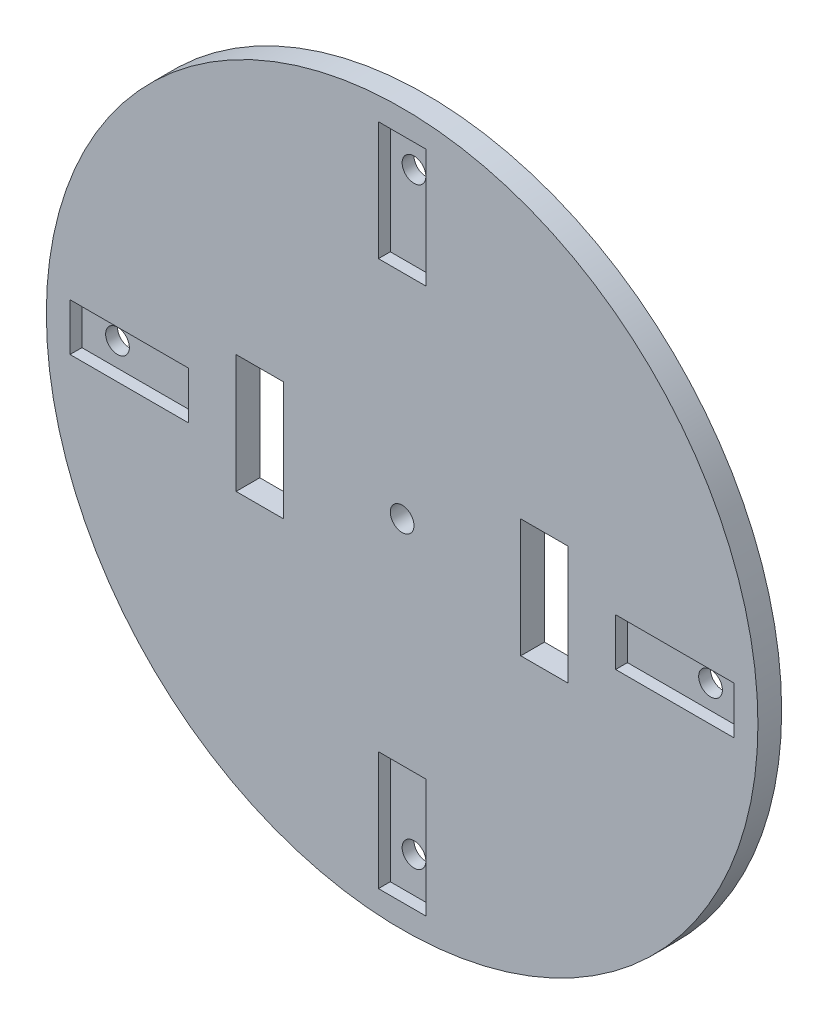
ISO-10303-21;
HEADER;
FILE_DESCRIPTION(('STEP AP214'),'2;1');
FILE_NAME('part.step','',(''),(''),'','','');
FILE_SCHEMA(('AUTOMOTIVE_DESIGN { 1 0 10303 214 1 1 1 1 }'));
ENDSEC;
DATA;
#1=APPLICATION_CONTEXT('core data for automotive mechanical design processes');
#2=APPLICATION_PROTOCOL_DEFINITION('international standard','automotive_design',2000,#1);
#3=PRODUCT_CONTEXT('',#1,'mechanical');
#4=PRODUCT('Part','Part','',(#3));
#5=PRODUCT_RELATED_PRODUCT_CATEGORY('part','',(#4));
#6=PRODUCT_DEFINITION_FORMATION('','',#4);
#7=PRODUCT_DEFINITION_CONTEXT('part definition',#1,'design');
#8=PRODUCT_DEFINITION('design','',#6,#7);
#9=PRODUCT_DEFINITION_SHAPE('','',#8);
#10=(LENGTH_UNIT() NAMED_UNIT(*) SI_UNIT(.MILLI.,.METRE.));
#11=(NAMED_UNIT(*) PLANE_ANGLE_UNIT() SI_UNIT($,.RADIAN.));
#12=(NAMED_UNIT(*) SI_UNIT($,.STERADIAN.) SOLID_ANGLE_UNIT());
#13=UNCERTAINTY_MEASURE_WITH_UNIT(LENGTH_MEASURE(1.E-05),#10,'distance_accuracy_value','');
#14=(GEOMETRIC_REPRESENTATION_CONTEXT(3) GLOBAL_UNCERTAINTY_ASSIGNED_CONTEXT((#13)) GLOBAL_UNIT_ASSIGNED_CONTEXT((#10,
#11,#12)) REPRESENTATION_CONTEXT('',''));
#15=CARTESIAN_POINT('',(0.,0.,0.));
#16=DIRECTION('',(0.,0.,1.));
#17=DIRECTION('',(1.,0.,0.));
#18=AXIS2_PLACEMENT_3D('',#15,#16,#17);
#19=CARTESIAN_POINT('',(-15.3907634201222,6.93034376227723,10.));
#20=DIRECTION('',(0.,0.,1.));
#21=DIRECTION('',(1.,0.,0.));
#22=AXIS2_PLACEMENT_3D('',#19,#20,#21);
#23=PLANE('',#22);
#24=DIRECTION('',(-1.,0.,0.));
#25=VECTOR('',#24,1.);
#26=CARTESIAN_POINT('',(-15.3907634201222,31.9303437622817,10.));
#27=LINE('',#26,#25);
#28=CARTESIAN_POINT('',(54.6092365798777,31.9303437622817,10.));
#29=VERTEX_POINT('',#28);
#30=CARTESIAN_POINT('',(34.6092365798778,31.9303437622817,10.));
#31=VERTEX_POINT('',#30);
#32=EDGE_CURVE('E202',#29,#31,#27,.T.);
#33=ORIENTED_EDGE('',*,*,#32,.F.);
#34=DIRECTION('',(0.,1.,0.));
#35=VECTOR('',#34,1.);
#36=CARTESIAN_POINT('',(54.6092365798778,6.93034376227724,10.));
#37=LINE('',#36,#35);
#38=CARTESIAN_POINT('',(54.6092365798778,-18.0696562377183,10.));
#39=VERTEX_POINT('',#38);
#40=EDGE_CURVE('E263',#39,#29,#37,.T.);
#41=ORIENTED_EDGE('',*,*,#40,.F.);
#42=DIRECTION('',(1.,0.,0.));
#43=VECTOR('',#42,1.);
#44=CARTESIAN_POINT('',(-15.3907634201222,-18.0696562377183,10.));
#45=LINE('',#44,#43);
#46=CARTESIAN_POINT('',(34.6092365798777,-18.0696562377183,10.));
#47=VERTEX_POINT('',#46);
#48=EDGE_CURVE('E261',#47,#39,#45,.T.);
#49=ORIENTED_EDGE('',*,*,#48,.F.);
#50=DIRECTION('',(0.,-1.,0.));
#51=VECTOR('',#50,1.);
#52=CARTESIAN_POINT('',(34.6092365798777,6.93034376227723,10.));
#53=LINE('',#52,#51);
#54=EDGE_CURVE('E259',#31,#47,#53,.T.);
#55=ORIENTED_EDGE('',*,*,#54,.F.);
#56=EDGE_LOOP('',(#33,#41,#49,#55));
#57=FACE_BOUND('',#56,.T.);
#58=DIRECTION('',(0.,1.,0.));
#59=VECTOR('',#58,1.);
#60=CARTESIAN_POINT('',(-65.3907634201223,6.93034376227723,10.));
#61=LINE('',#60,#59);
#62=CARTESIAN_POINT('',(-65.3907634201223,-18.0696562377228,10.));
#63=VERTEX_POINT('',#62);
#64=CARTESIAN_POINT('',(-65.3907634201223,31.9303437622772,10.));
#65=VERTEX_POINT('',#64);
#66=EDGE_CURVE('E257',#63,#65,#61,.T.);
#67=ORIENTED_EDGE('',*,*,#66,.F.);
#68=DIRECTION('',(1.,0.,0.));
#69=VECTOR('',#68,1.);
#70=CARTESIAN_POINT('',(-15.3907634201222,-18.0696562377228,10.));
#71=LINE('',#70,#69);
#72=CARTESIAN_POINT('',(-85.3907634201223,-18.0696562377228,10.));
#73=VERTEX_POINT('',#72);
#74=EDGE_CURVE('E255',#73,#63,#71,.T.);
#75=ORIENTED_EDGE('',*,*,#74,.F.);
#76=DIRECTION('',(0.,-1.,0.));
#77=VECTOR('',#76,1.);
#78=CARTESIAN_POINT('',(-85.3907634201223,6.93034376227723,10.));
#79=LINE('',#78,#77);
#80=CARTESIAN_POINT('',(-85.3907634201223,31.9303437622772,10.));
#81=VERTEX_POINT('',#80);
#82=EDGE_CURVE('E253',#81,#73,#79,.T.);
#83=ORIENTED_EDGE('',*,*,#82,.F.);
#84=DIRECTION('',(-1.,0.,0.));
#85=VECTOR('',#84,1.);
#86=CARTESIAN_POINT('',(-15.3907634201222,31.9303437622772,10.));
#87=LINE('',#86,#85);
#88=EDGE_CURVE('E229',#65,#81,#87,.T.);
#89=ORIENTED_EDGE('',*,*,#88,.F.);
#90=EDGE_LOOP('',(#67,#75,#83,#89));
#91=FACE_BOUND('',#90,.T.);
#92=DIRECTION('',(0.,1.,0.));
#93=VECTOR('',#92,1.);
#94=CARTESIAN_POINT('',(-5.39076342012216,146.930343762277,10.));
#95=LINE('',#94,#93);
#96=CARTESIAN_POINT('',(-5.39076342012216,96.9303437622773,10.));
#97=VERTEX_POINT('',#96);
#98=CARTESIAN_POINT('',(-5.39076342012216,146.930343762277,10.));
#99=VERTEX_POINT('',#98);
#100=EDGE_CURVE('E305',#97,#99,#95,.T.);
#101=ORIENTED_EDGE('',*,*,#100,.F.);
#102=DIRECTION('',(1.,0.,0.));
#103=VECTOR('',#102,1.);
#104=CARTESIAN_POINT('',(-25.3907634201222,96.9303437622773,10.));
#105=LINE('',#104,#103);
#106=CARTESIAN_POINT('',(-25.3907634201222,96.9303437622773,10.));
#107=VERTEX_POINT('',#106);
#108=EDGE_CURVE('E295',#107,#97,#105,.T.);
#109=ORIENTED_EDGE('',*,*,#108,.F.);
#110=DIRECTION('',(0.,-1.,0.));
#111=VECTOR('',#110,1.);
#112=CARTESIAN_POINT('',(-25.3907634201222,146.930343762277,10.));
#113=LINE('',#112,#111);
#114=CARTESIAN_POINT('',(-25.3907634201222,146.930343762277,10.));
#115=VERTEX_POINT('',#114);
#116=EDGE_CURVE('E311',#115,#107,#113,.T.);
#117=ORIENTED_EDGE('',*,*,#116,.F.);
#118=DIRECTION('',(-1.,0.,0.));
#119=VECTOR('',#118,1.);
#120=CARTESIAN_POINT('',(-25.3907634201222,146.930343762277,10.));
#121=LINE('',#120,#119);
#122=EDGE_CURVE('E307',#99,#115,#121,.T.);
#123=ORIENTED_EDGE('',*,*,#122,.F.);
#124=EDGE_LOOP('',(#101,#109,#117,#123));
#125=FACE_BOUND('',#124,.T.);
#126=DIRECTION('',(0.,-1.,0.));
#127=VECTOR('',#126,1.);
#128=CARTESIAN_POINT('',(74.6092365798779,16.9303437622769,10.));
#129=LINE('',#128,#127);
#130=CARTESIAN_POINT('',(74.6092365798779,16.9303437622769,10.));
#131=VERTEX_POINT('',#130);
#132=CARTESIAN_POINT('',(74.6092365798778,-3.06965623772309,10.));
#133=VERTEX_POINT('',#132);
#134=EDGE_CURVE('E308',#131,#133,#129,.T.);
#135=ORIENTED_EDGE('',*,*,#134,.F.);
#136=DIRECTION('',(-1.,0.,0.));
#137=VECTOR('',#136,1.);
#138=CARTESIAN_POINT('',(124.609236579878,16.9303437622767,10.));
#139=LINE('',#138,#137);
#140=CARTESIAN_POINT('',(124.609236579878,16.9303437622767,10.));
#141=VERTEX_POINT('',#140);
#142=EDGE_CURVE('E336',#141,#131,#139,.T.);
#143=ORIENTED_EDGE('',*,*,#142,.F.);
#144=DIRECTION('',(0.,1.,0.));
#145=VECTOR('',#144,1.);
#146=CARTESIAN_POINT('',(124.609236579878,16.9303437622767,10.));
#147=LINE('',#146,#145);
#148=CARTESIAN_POINT('',(124.609236579878,-3.06965623772327,10.));
#149=VERTEX_POINT('',#148);
#150=EDGE_CURVE('E339',#149,#141,#147,.T.);
#151=ORIENTED_EDGE('',*,*,#150,.F.);
#152=DIRECTION('',(1.,0.,0.));
#153=VECTOR('',#152,1.);
#154=CARTESIAN_POINT('',(124.609236579878,-3.06965623772327,10.));
#155=LINE('',#154,#153);
#156=EDGE_CURVE('E343',#133,#149,#155,.T.);
#157=ORIENTED_EDGE('',*,*,#156,.F.);
#158=EDGE_LOOP('',(#135,#143,#151,#157));
#159=FACE_BOUND('',#158,.T.);
#160=DIRECTION('',(-1.,0.,0.));
#161=VECTOR('',#160,1.);
#162=CARTESIAN_POINT('',(-5.39076342012279,-83.0696562377229,10.));
#163=LINE('',#162,#161);
#164=CARTESIAN_POINT('',(-5.39076342012279,-83.0696562377229,10.));
#165=VERTEX_POINT('',#164);
#166=CARTESIAN_POINT('',(-25.3907634201228,-83.0696562377227,10.));
#167=VERTEX_POINT('',#166);
#168=EDGE_CURVE('E335',#165,#167,#163,.T.);
#169=ORIENTED_EDGE('',*,*,#168,.F.);
#170=DIRECTION('',(0.,1.,0.));
#171=VECTOR('',#170,1.);
#172=CARTESIAN_POINT('',(-5.39076342012314,-133.069656237723,10.));
#173=LINE('',#172,#171);
#174=CARTESIAN_POINT('',(-5.39076342012314,-133.069656237723,10.));
#175=VERTEX_POINT('',#174);
#176=EDGE_CURVE('E368',#175,#165,#173,.T.);
#177=ORIENTED_EDGE('',*,*,#176,.F.);
#178=DIRECTION('',(1.,0.,0.));
#179=VECTOR('',#178,1.);
#180=CARTESIAN_POINT('',(-5.39076342012314,-133.069656237723,10.));
#181=LINE('',#180,#179);
#182=CARTESIAN_POINT('',(-25.3907634201231,-133.069656237723,10.));
#183=VERTEX_POINT('',#182);
#184=EDGE_CURVE('E371',#183,#175,#181,.T.);
#185=ORIENTED_EDGE('',*,*,#184,.F.);
#186=DIRECTION('',(0.,-1.,0.));
#187=VECTOR('',#186,1.);
#188=CARTESIAN_POINT('',(-25.3907634201231,-133.069656237723,10.));
#189=LINE('',#188,#187);
#190=EDGE_CURVE('E375',#167,#183,#189,.T.);
#191=ORIENTED_EDGE('',*,*,#190,.F.);
#192=EDGE_LOOP('',(#169,#177,#185,#191));
#193=FACE_BOUND('',#192,.T.);
#194=DIRECTION('',(0.,1.,0.));
#195=VECTOR('',#194,1.);
#196=CARTESIAN_POINT('',(-105.390763420122,-3.06965623772184,10.));
#197=LINE('',#196,#195);
#198=CARTESIAN_POINT('',(-105.390763420122,-3.06965623772184,10.));
#199=VERTEX_POINT('',#198);
#200=CARTESIAN_POINT('',(-105.390763420122,16.9303437622782,10.));
#201=VERTEX_POINT('',#200);
#202=EDGE_CURVE('E367',#199,#201,#197,.T.);
#203=ORIENTED_EDGE('',*,*,#202,.F.);
#204=DIRECTION('',(1.,0.,0.));
#205=VECTOR('',#204,1.);
#206=CARTESIAN_POINT('',(-155.390763420122,-3.06965623772131,10.));
#207=LINE('',#206,#205);
#208=CARTESIAN_POINT('',(-155.390763420122,-3.06965623772131,10.));
#209=VERTEX_POINT('',#208);
#210=EDGE_CURVE('E398',#209,#199,#207,.T.);
#211=ORIENTED_EDGE('',*,*,#210,.F.);
#212=DIRECTION('',(0.,-1.,0.));
#213=VECTOR('',#212,1.);
#214=CARTESIAN_POINT('',(-155.390763420122,-3.06965623772131,10.));
#215=LINE('',#214,#213);
#216=CARTESIAN_POINT('',(-155.390763420122,16.9303437622787,10.));
#217=VERTEX_POINT('',#216);
#218=EDGE_CURVE('E401',#217,#209,#215,.T.);
#219=ORIENTED_EDGE('',*,*,#218,.F.);
#220=DIRECTION('',(-1.,0.,0.));
#221=VECTOR('',#220,1.);
#222=CARTESIAN_POINT('',(-155.390763420122,16.9303437622787,10.));
#223=LINE('',#222,#221);
#224=EDGE_CURVE('E405',#201,#217,#223,.T.);
#225=ORIENTED_EDGE('',*,*,#224,.F.);
#226=EDGE_LOOP('',(#203,#211,#219,#225));
#227=FACE_BOUND('',#226,.T.);
#228=CARTESIAN_POINT('',(-15.3907634201222,6.93034376227723,10.));
#229=DIRECTION('',(0.,0.,1.));
#230=DIRECTION('',(1.,0.,0.));
#231=AXIS2_PLACEMENT_3D('',#228,#229,#230);
#232=CIRCLE('',#231,150.);
#233=CARTESIAN_POINT('',(134.609236579878,6.93034376227723,10.));
#234=VERTEX_POINT('',#233);
#235=EDGE_CURVE('E11',#234,#234,#232,.T.);
#236=ORIENTED_EDGE('',*,*,#235,.T.);
#237=EDGE_LOOP('',(#236));
#238=FACE_BOUND('',#237,.T.);
#239=CARTESIAN_POINT('',(-15.3907634201222,6.93034376227723,10.));
#240=DIRECTION('',(0.,0.,1.));
#241=DIRECTION('',(1.,0.,0.));
#242=AXIS2_PLACEMENT_3D('',#239,#240,#241);
#243=CIRCLE('',#242,5.);
#244=CARTESIAN_POINT('',(-10.3907634201222,6.93034376227723,10.));
#245=VERTEX_POINT('',#244);
#246=EDGE_CURVE('E419',#245,#245,#243,.T.);
#247=ORIENTED_EDGE('',*,*,#246,.F.);
#248=EDGE_LOOP('',(#247));
#249=FACE_BOUND('',#248,.T.);
#250=ADVANCED_FACE('F36',(#57,#91,#125,#159,#193,#227,#238,#249),#23,.T.);
#251=CARTESIAN_POINT('',(-15.3907634201222,6.93034376227723,0.));
#252=DIRECTION('',(0.,0.,1.));
#253=DIRECTION('',(1.,0.,0.));
#254=AXIS2_PLACEMENT_3D('',#251,#252,#253);
#255=PLANE('',#254);
#256=DIRECTION('',(0.,1.,0.));
#257=VECTOR('',#256,1.);
#258=CARTESIAN_POINT('',(54.6092365798778,-18.0696562377183,0.));
#259=LINE('',#258,#257);
#260=CARTESIAN_POINT('',(54.6092365798778,-18.0696562377183,0.));
#261=VERTEX_POINT('',#260);
#262=CARTESIAN_POINT('',(54.6092365798777,31.9303437622817,0.));
#263=VERTEX_POINT('',#262);
#264=EDGE_CURVE('E205',#261,#263,#259,.T.);
#265=ORIENTED_EDGE('',*,*,#264,.T.);
#266=DIRECTION('',(-1.,0.,0.));
#267=VECTOR('',#266,1.);
#268=CARTESIAN_POINT('',(54.6092365798777,31.9303437622817,0.));
#269=LINE('',#268,#267);
#270=CARTESIAN_POINT('',(34.6092365798778,31.9303437622817,0.));
#271=VERTEX_POINT('',#270);
#272=EDGE_CURVE('E199',#263,#271,#269,.T.);
#273=ORIENTED_EDGE('',*,*,#272,.T.);
#274=DIRECTION('',(0.,-1.,0.));
#275=VECTOR('',#274,1.);
#276=CARTESIAN_POINT('',(34.6092365798777,-18.0696562377183,0.));
#277=LINE('',#276,#275);
#278=CARTESIAN_POINT('',(34.6092365798777,-18.0696562377183,0.));
#279=VERTEX_POINT('',#278);
#280=EDGE_CURVE('E209',#271,#279,#277,.T.);
#281=ORIENTED_EDGE('',*,*,#280,.T.);
#282=DIRECTION('',(1.,0.,0.));
#283=VECTOR('',#282,1.);
#284=CARTESIAN_POINT('',(54.6092365798778,-18.0696562377183,0.));
#285=LINE('',#284,#283);
#286=EDGE_CURVE('E214',#279,#261,#285,.T.);
#287=ORIENTED_EDGE('',*,*,#286,.T.);
#288=EDGE_LOOP('',(#265,#273,#281,#287));
#289=FACE_BOUND('',#288,.T.);
#290=DIRECTION('',(1.,0.,0.));
#291=VECTOR('',#290,1.);
#292=CARTESIAN_POINT('',(-85.3907634201223,-18.0696562377228,0.));
#293=LINE('',#292,#291);
#294=CARTESIAN_POINT('',(-85.3907634201223,-18.0696562377228,0.));
#295=VERTEX_POINT('',#294);
#296=CARTESIAN_POINT('',(-65.3907634201223,-18.0696562377228,0.));
#297=VERTEX_POINT('',#296);
#298=EDGE_CURVE('E235',#295,#297,#293,.T.);
#299=ORIENTED_EDGE('',*,*,#298,.T.);
#300=DIRECTION('',(0.,1.,0.));
#301=VECTOR('',#300,1.);
#302=CARTESIAN_POINT('',(-65.3907634201223,31.9303437622772,0.));
#303=LINE('',#302,#301);
#304=CARTESIAN_POINT('',(-65.3907634201223,31.9303437622772,0.));
#305=VERTEX_POINT('',#304);
#306=EDGE_CURVE('E219',#297,#305,#303,.T.);
#307=ORIENTED_EDGE('',*,*,#306,.T.);
#308=DIRECTION('',(-1.,0.,0.));
#309=VECTOR('',#308,1.);
#310=CARTESIAN_POINT('',(-85.3907634201223,31.9303437622772,0.));
#311=LINE('',#310,#309);
#312=CARTESIAN_POINT('',(-85.3907634201223,31.9303437622772,0.));
#313=VERTEX_POINT('',#312);
#314=EDGE_CURVE('E222',#305,#313,#311,.T.);
#315=ORIENTED_EDGE('',*,*,#314,.T.);
#316=DIRECTION('',(0.,-1.,0.));
#317=VECTOR('',#316,1.);
#318=CARTESIAN_POINT('',(-85.3907634201223,31.9303437622772,0.));
#319=LINE('',#318,#317);
#320=EDGE_CURVE('E247',#313,#295,#319,.T.);
#321=ORIENTED_EDGE('',*,*,#320,.T.);
#322=EDGE_LOOP('',(#299,#307,#315,#321));
#323=FACE_BOUND('',#322,.T.);
#324=CARTESIAN_POINT('',(109.609236579878,6.93034376227691,0.));
#325=DIRECTION('',(0.,0.,1.));
#326=DIRECTION('',(1.,0.,0.));
#327=AXIS2_PLACEMENT_3D('',#324,#325,#326);
#328=CIRCLE('',#327,5.);
#329=CARTESIAN_POINT('',(114.609236579878,6.93034376227691,0.));
#330=VERTEX_POINT('',#329);
#331=EDGE_CURVE('E267',#330,#330,#328,.T.);
#332=ORIENTED_EDGE('',*,*,#331,.T.);
#333=EDGE_LOOP('',(#332));
#334=FACE_BOUND('',#333,.T.);
#335=CARTESIAN_POINT('',(-15.3907634201229,-118.069656237723,0.));
#336=DIRECTION('',(0.,0.,1.));
#337=DIRECTION('',(1.,0.,0.));
#338=AXIS2_PLACEMENT_3D('',#335,#336,#337);
#339=CIRCLE('',#338,5.);
#340=CARTESIAN_POINT('',(-10.3907634201229,-118.069656237723,0.));
#341=VERTEX_POINT('',#340);
#342=EDGE_CURVE('E277',#341,#341,#339,.T.);
#343=ORIENTED_EDGE('',*,*,#342,.T.);
#344=EDGE_LOOP('',(#343));
#345=FACE_BOUND('',#344,.T.);
#346=CARTESIAN_POINT('',(-140.390763420122,6.93034376227837,0.));
#347=DIRECTION('',(0.,0.,1.));
#348=DIRECTION('',(1.,0.,0.));
#349=AXIS2_PLACEMENT_3D('',#346,#347,#348);
#350=CIRCLE('',#349,5.00000000000003);
#351=CARTESIAN_POINT('',(-135.390763420122,6.93034376227837,0.));
#352=VERTEX_POINT('',#351);
#353=EDGE_CURVE('E283',#352,#352,#350,.T.);
#354=ORIENTED_EDGE('',*,*,#353,.T.);
#355=EDGE_LOOP('',(#354));
#356=FACE_BOUND('',#355,.T.);
#357=CARTESIAN_POINT('',(-15.3907634201205,131.930343762277,0.));
#358=DIRECTION('',(0.,0.,1.));
#359=DIRECTION('',(1.,0.,0.));
#360=AXIS2_PLACEMENT_3D('',#357,#358,#359);
#361=CIRCLE('',#360,4.99999999999998);
#362=CARTESIAN_POINT('',(-10.3907634201206,131.930343762277,0.));
#363=VERTEX_POINT('',#362);
#364=EDGE_CURVE('E266',#363,#363,#361,.T.);
#365=ORIENTED_EDGE('',*,*,#364,.T.);
#366=EDGE_LOOP('',(#365));
#367=FACE_BOUND('',#366,.T.);
#368=CARTESIAN_POINT('',(-15.3907634201222,6.93034376227723,0.));
#369=DIRECTION('',(0.,0.,1.));
#370=DIRECTION('',(1.,0.,0.));
#371=AXIS2_PLACEMENT_3D('',#368,#369,#370);
#372=CIRCLE('',#371,150.);
#373=CARTESIAN_POINT('',(134.609236579878,6.93034376227723,0.));
#374=VERTEX_POINT('',#373);
#375=EDGE_CURVE('E40',#374,#374,#372,.T.);
#376=ORIENTED_EDGE('',*,*,#375,.F.);
#377=EDGE_LOOP('',(#376));
#378=FACE_BOUND('',#377,.T.);
#379=CARTESIAN_POINT('',(-15.3907634201222,6.93034376227723,0.));
#380=DIRECTION('',(0.,0.,1.));
#381=DIRECTION('',(1.,0.,0.));
#382=AXIS2_PLACEMENT_3D('',#379,#380,#381);
#383=CIRCLE('',#382,5.);
#384=CARTESIAN_POINT('',(-10.3907634201222,6.93034376227723,0.));
#385=VERTEX_POINT('',#384);
#386=EDGE_CURVE('E318',#385,#385,#383,.T.);
#387=ORIENTED_EDGE('',*,*,#386,.T.);
#388=EDGE_LOOP('',(#387));
#389=FACE_BOUND('',#388,.T.);
#390=ADVANCED_FACE('F216',(#289,#323,#334,#345,#356,#367,#378,#389),#255,.F.);
#391=CARTESIAN_POINT('',(-15.3907634201222,6.93034376227723,10.));
#392=DIRECTION('',(0.,0.,-1.));
#393=DIRECTION('',(-1.,0.,0.));
#394=AXIS2_PLACEMENT_3D('',#391,#392,#393);
#395=CYLINDRICAL_SURFACE('',#394,150.);
#396=ORIENTED_EDGE('',*,*,#235,.F.);
#397=EDGE_LOOP('',(#396));
#398=FACE_BOUND('',#397,.T.);
#399=ORIENTED_EDGE('',*,*,#375,.T.);
#400=EDGE_LOOP('',(#399));
#401=FACE_BOUND('',#400,.T.);
#402=ADVANCED_FACE('F38',(#398,#401),#395,.T.);
#403=CARTESIAN_POINT('',(-15.3907634201222,6.93034376227723,10.));
#404=DIRECTION('',(0.,0.,-1.));
#405=DIRECTION('',(-1.,0.,0.));
#406=AXIS2_PLACEMENT_3D('',#403,#404,#405);
#407=CYLINDRICAL_SURFACE('',#406,5.);
#408=ORIENTED_EDGE('',*,*,#246,.T.);
#409=EDGE_LOOP('',(#408));
#410=FACE_BOUND('',#409,.T.);
#411=ORIENTED_EDGE('',*,*,#386,.F.);
#412=EDGE_LOOP('',(#411));
#413=FACE_BOUND('',#412,.T.);
#414=ADVANCED_FACE('F426',(#410,#413),#407,.F.);
#415=CARTESIAN_POINT('',(-105.390763420122,-3.06965623772184,5.));
#416=DIRECTION('',(1.,0.,0.));
#417=DIRECTION('',(0.,1.,0.));
#418=AXIS2_PLACEMENT_3D('',#415,#416,#417);
#419=PLANE('',#418);
#420=ORIENTED_EDGE('',*,*,#202,.T.);
#421=DIRECTION('',(0.,0.,1.));
#422=VECTOR('',#421,1.);
#423=CARTESIAN_POINT('',(-105.390763420122,16.9303437622782,5.));
#424=LINE('',#423,#422);
#425=CARTESIAN_POINT('',(-105.390763420122,16.9303437622782,5.));
#426=VERTEX_POINT('',#425);
#427=EDGE_CURVE('E389',#426,#201,#424,.T.);
#428=ORIENTED_EDGE('',*,*,#427,.F.);
#429=DIRECTION('',(0.,1.,0.));
#430=VECTOR('',#429,1.);
#431=CARTESIAN_POINT('',(-105.390763420122,-3.06965623772184,5.));
#432=LINE('',#431,#430);
#433=CARTESIAN_POINT('',(-105.390763420122,-3.06965623772184,5.));
#434=VERTEX_POINT('',#433);
#435=EDGE_CURVE('E402',#434,#426,#432,.T.);
#436=ORIENTED_EDGE('',*,*,#435,.F.);
#437=DIRECTION('',(0.,0.,1.));
#438=VECTOR('',#437,1.);
#439=CARTESIAN_POINT('',(-105.390763420122,-3.06965623772184,5.));
#440=LINE('',#439,#438);
#441=EDGE_CURVE('E270',#434,#199,#440,.T.);
#442=ORIENTED_EDGE('',*,*,#441,.T.);
#443=EDGE_LOOP('',(#420,#428,#436,#442));
#444=FACE_BOUND('',#443,.T.);
#445=ADVANCED_FACE('F428',(#444),#419,.F.);
#446=CARTESIAN_POINT('',(-155.390763420122,-3.06965623772131,5.));
#447=DIRECTION('',(0.,-1.,0.));
#448=DIRECTION('',(1.,0.,0.));
#449=AXIS2_PLACEMENT_3D('',#446,#447,#448);
#450=PLANE('',#449);
#451=ORIENTED_EDGE('',*,*,#210,.T.);
#452=ORIENTED_EDGE('',*,*,#441,.F.);
#453=DIRECTION('',(1.,0.,0.));
#454=VECTOR('',#453,1.);
#455=CARTESIAN_POINT('',(-155.390763420122,-3.06965623772131,5.));
#456=LINE('',#455,#454);
#457=CARTESIAN_POINT('',(-155.390763420122,-3.06965623772131,5.));
#458=VERTEX_POINT('',#457);
#459=EDGE_CURVE('E392',#458,#434,#456,.T.);
#460=ORIENTED_EDGE('',*,*,#459,.F.);
#461=DIRECTION('',(0.,0.,1.));
#462=VECTOR('',#461,1.);
#463=CARTESIAN_POINT('',(-155.390763420122,-3.06965623772131,5.));
#464=LINE('',#463,#462);
#465=EDGE_CURVE('E395',#458,#209,#464,.T.);
#466=ORIENTED_EDGE('',*,*,#465,.T.);
#467=EDGE_LOOP('',(#451,#452,#460,#466));
#468=FACE_BOUND('',#467,.T.);
#469=ADVANCED_FACE('F435',(#468),#450,.F.);
#470=CARTESIAN_POINT('',(-155.390763420122,-3.06965623772131,5.));
#471=DIRECTION('',(-1.,0.,0.));
#472=DIRECTION('',(0.,-1.,0.));
#473=AXIS2_PLACEMENT_3D('',#470,#471,#472);
#474=PLANE('',#473);
#475=ORIENTED_EDGE('',*,*,#218,.T.);
#476=ORIENTED_EDGE('',*,*,#465,.F.);
#477=DIRECTION('',(0.,-1.,0.));
#478=VECTOR('',#477,1.);
#479=CARTESIAN_POINT('',(-155.390763420122,-3.06965623772131,5.));
#480=LINE('',#479,#478);
#481=CARTESIAN_POINT('',(-155.390763420122,16.9303437622787,5.));
#482=VERTEX_POINT('',#481);
#483=EDGE_CURVE('E411',#482,#458,#480,.T.);
#484=ORIENTED_EDGE('',*,*,#483,.F.);
#485=DIRECTION('',(0.,0.,1.));
#486=VECTOR('',#485,1.);
#487=CARTESIAN_POINT('',(-155.390763420122,16.9303437622787,5.));
#488=LINE('',#487,#486);
#489=EDGE_CURVE('E393',#482,#217,#488,.T.);
#490=ORIENTED_EDGE('',*,*,#489,.T.);
#491=EDGE_LOOP('',(#475,#476,#484,#490));
#492=FACE_BOUND('',#491,.T.);
#493=ADVANCED_FACE('F486',(#492),#474,.F.);
#494=CARTESIAN_POINT('',(-155.390763420122,16.9303437622787,5.));
#495=DIRECTION('',(0.,1.,0.));
#496=DIRECTION('',(-1.,0.,0.));
#497=AXIS2_PLACEMENT_3D('',#494,#495,#496);
#498=PLANE('',#497);
#499=ORIENTED_EDGE('',*,*,#224,.T.);
#500=ORIENTED_EDGE('',*,*,#489,.F.);
#501=DIRECTION('',(-1.,0.,0.));
#502=VECTOR('',#501,1.);
#503=CARTESIAN_POINT('',(-155.390763420122,16.9303437622787,5.));
#504=LINE('',#503,#502);
#505=EDGE_CURVE('E414',#426,#482,#504,.T.);
#506=ORIENTED_EDGE('',*,*,#505,.F.);
#507=ORIENTED_EDGE('',*,*,#427,.T.);
#508=EDGE_LOOP('',(#499,#500,#506,#507));
#509=FACE_BOUND('',#508,.T.);
#510=ADVANCED_FACE('F479',(#509),#498,.F.);
#511=CARTESIAN_POINT('',(0.,0.,5.));
#512=DIRECTION('',(0.,0.,-1.));
#513=DIRECTION('',(-1.,0.,0.));
#514=AXIS2_PLACEMENT_3D('',#511,#512,#513);
#515=PLANE('',#514);
#516=CARTESIAN_POINT('',(-140.390763420122,6.93034376227837,5.));
#517=DIRECTION('',(0.,0.,1.));
#518=DIRECTION('',(1.,0.,0.));
#519=AXIS2_PLACEMENT_3D('',#516,#517,#518);
#520=CIRCLE('',#519,5.00000000000003);
#521=CARTESIAN_POINT('',(-135.390763420122,6.93034376227837,5.));
#522=VERTEX_POINT('',#521);
#523=EDGE_CURVE('E280',#522,#522,#520,.T.);
#524=ORIENTED_EDGE('',*,*,#523,.F.);
#525=EDGE_LOOP('',(#524));
#526=FACE_BOUND('',#525,.T.);
#527=ORIENTED_EDGE('',*,*,#435,.T.);
#528=ORIENTED_EDGE('',*,*,#505,.T.);
#529=ORIENTED_EDGE('',*,*,#483,.T.);
#530=ORIENTED_EDGE('',*,*,#459,.T.);
#531=EDGE_LOOP('',(#527,#528,#529,#530));
#532=FACE_BOUND('',#531,.T.);
#533=ADVANCED_FACE('F482',(#526,#532),#515,.F.);
#534=CARTESIAN_POINT('',(-5.39076342012279,-83.0696562377229,5.));
#535=DIRECTION('',(0.,1.,0.));
#536=DIRECTION('',(-1.,0.,0.));
#537=AXIS2_PLACEMENT_3D('',#534,#535,#536);
#538=PLANE('',#537);
#539=ORIENTED_EDGE('',*,*,#168,.T.);
#540=DIRECTION('',(0.,0.,1.));
#541=VECTOR('',#540,1.);
#542=CARTESIAN_POINT('',(-25.3907634201228,-83.0696562377227,5.));
#543=LINE('',#542,#541);
#544=CARTESIAN_POINT('',(-25.3907634201228,-83.0696562377227,5.));
#545=VERTEX_POINT('',#544);
#546=EDGE_CURVE('E357',#545,#167,#543,.T.);
#547=ORIENTED_EDGE('',*,*,#546,.F.);
#548=DIRECTION('',(-1.,0.,0.));
#549=VECTOR('',#548,1.);
#550=CARTESIAN_POINT('',(-5.39076342012279,-83.0696562377229,5.));
#551=LINE('',#550,#549);
#552=CARTESIAN_POINT('',(-5.39076342012279,-83.0696562377229,5.));
#553=VERTEX_POINT('',#552);
#554=EDGE_CURVE('E372',#553,#545,#551,.T.);
#555=ORIENTED_EDGE('',*,*,#554,.F.);
#556=DIRECTION('',(0.,0.,1.));
#557=VECTOR('',#556,1.);
#558=CARTESIAN_POINT('',(-5.39076342012279,-83.0696562377229,5.));
#559=LINE('',#558,#557);
#560=EDGE_CURVE('E365',#553,#165,#559,.T.);
#561=ORIENTED_EDGE('',*,*,#560,.T.);
#562=EDGE_LOOP('',(#539,#547,#555,#561));
#563=FACE_BOUND('',#562,.T.);
#564=ADVANCED_FACE('F496',(#563),#538,.F.);
#565=CARTESIAN_POINT('',(-5.39076342012314,-133.069656237723,5.));
#566=DIRECTION('',(1.,0.,0.));
#567=DIRECTION('',(0.,1.,0.));
#568=AXIS2_PLACEMENT_3D('',#565,#566,#567);
#569=PLANE('',#568);
#570=ORIENTED_EDGE('',*,*,#176,.T.);
#571=ORIENTED_EDGE('',*,*,#560,.F.);
#572=DIRECTION('',(0.,1.,0.));
#573=VECTOR('',#572,1.);
#574=CARTESIAN_POINT('',(-5.39076342012314,-133.069656237723,5.));
#575=LINE('',#574,#573);
#576=CARTESIAN_POINT('',(-5.39076342012314,-133.069656237723,5.));
#577=VERTEX_POINT('',#576);
#578=EDGE_CURVE('E360',#577,#553,#575,.T.);
#579=ORIENTED_EDGE('',*,*,#578,.F.);
#580=DIRECTION('',(0.,0.,1.));
#581=VECTOR('',#580,1.);
#582=CARTESIAN_POINT('',(-5.39076342012314,-133.069656237723,5.));
#583=LINE('',#582,#581);
#584=EDGE_CURVE('E363',#577,#175,#583,.T.);
#585=ORIENTED_EDGE('',*,*,#584,.T.);
#586=EDGE_LOOP('',(#570,#571,#579,#585));
#587=FACE_BOUND('',#586,.T.);
#588=ADVANCED_FACE('F501',(#587),#569,.F.);
#589=CARTESIAN_POINT('',(-5.39076342012314,-133.069656237723,5.));
#590=DIRECTION('',(0.,-1.,0.));
#591=DIRECTION('',(1.,0.,0.));
#592=AXIS2_PLACEMENT_3D('',#589,#590,#591);
#593=PLANE('',#592);
#594=ORIENTED_EDGE('',*,*,#184,.T.);
#595=ORIENTED_EDGE('',*,*,#584,.F.);
#596=DIRECTION('',(1.,0.,0.));
#597=VECTOR('',#596,1.);
#598=CARTESIAN_POINT('',(-5.39076342012314,-133.069656237723,5.));
#599=LINE('',#598,#597);
#600=CARTESIAN_POINT('',(-25.3907634201231,-133.069656237723,5.));
#601=VERTEX_POINT('',#600);
#602=EDGE_CURVE('E381',#601,#577,#599,.T.);
#603=ORIENTED_EDGE('',*,*,#602,.F.);
#604=DIRECTION('',(0.,0.,1.));
#605=VECTOR('',#604,1.);
#606=CARTESIAN_POINT('',(-25.3907634201231,-133.069656237723,5.));
#607=LINE('',#606,#605);
#608=EDGE_CURVE('E361',#601,#183,#607,.T.);
#609=ORIENTED_EDGE('',*,*,#608,.T.);
#610=EDGE_LOOP('',(#594,#595,#603,#609));
#611=FACE_BOUND('',#610,.T.);
#612=ADVANCED_FACE('F573',(#611),#593,.F.);
#613=CARTESIAN_POINT('',(-25.3907634201231,-133.069656237723,5.));
#614=DIRECTION('',(-1.,0.,0.));
#615=DIRECTION('',(0.,-1.,0.));
#616=AXIS2_PLACEMENT_3D('',#613,#614,#615);
#617=PLANE('',#616);
#618=ORIENTED_EDGE('',*,*,#190,.T.);
#619=ORIENTED_EDGE('',*,*,#608,.F.);
#620=DIRECTION('',(0.,-1.,0.));
#621=VECTOR('',#620,1.);
#622=CARTESIAN_POINT('',(-25.3907634201231,-133.069656237723,5.));
#623=LINE('',#622,#621);
#624=EDGE_CURVE('E384',#545,#601,#623,.T.);
#625=ORIENTED_EDGE('',*,*,#624,.F.);
#626=ORIENTED_EDGE('',*,*,#546,.T.);
#627=EDGE_LOOP('',(#618,#619,#625,#626));
#628=FACE_BOUND('',#627,.T.);
#629=ADVANCED_FACE('F570',(#628),#617,.F.);
#630=CARTESIAN_POINT('',(0.,0.,5.));
#631=DIRECTION('',(0.,0.,-1.));
#632=DIRECTION('',(-1.,0.,0.));
#633=AXIS2_PLACEMENT_3D('',#630,#631,#632);
#634=PLANE('',#633);
#635=CARTESIAN_POINT('',(-15.3907634201229,-118.069656237723,5.));
#636=DIRECTION('',(0.,0.,1.));
#637=DIRECTION('',(1.,0.,0.));
#638=AXIS2_PLACEMENT_3D('',#635,#636,#637);
#639=CIRCLE('',#638,5.);
#640=CARTESIAN_POINT('',(-10.3907634201229,-118.069656237723,5.));
#641=VERTEX_POINT('',#640);
#642=EDGE_CURVE('E274',#641,#641,#639,.T.);
#643=ORIENTED_EDGE('',*,*,#642,.F.);
#644=EDGE_LOOP('',(#643));
#645=FACE_BOUND('',#644,.T.);
#646=ORIENTED_EDGE('',*,*,#554,.T.);
#647=ORIENTED_EDGE('',*,*,#624,.T.);
#648=ORIENTED_EDGE('',*,*,#602,.T.);
#649=ORIENTED_EDGE('',*,*,#578,.T.);
#650=EDGE_LOOP('',(#646,#647,#648,#649));
#651=FACE_BOUND('',#650,.T.);
#652=ADVANCED_FACE('F554',(#645,#651),#634,.F.);
#653=CARTESIAN_POINT('',(74.6092365798779,16.9303437622769,5.));
#654=DIRECTION('',(-1.,0.,0.));
#655=DIRECTION('',(0.,-1.,0.));
#656=AXIS2_PLACEMENT_3D('',#653,#654,#655);
#657=PLANE('',#656);
#658=ORIENTED_EDGE('',*,*,#134,.T.);
#659=DIRECTION('',(0.,0.,1.));
#660=VECTOR('',#659,1.);
#661=CARTESIAN_POINT('',(74.6092365798778,-3.06965623772309,5.));
#662=LINE('',#661,#660);
#663=CARTESIAN_POINT('',(74.6092365798778,-3.06965623772309,5.));
#664=VERTEX_POINT('',#663);
#665=EDGE_CURVE('E325',#664,#133,#662,.T.);
#666=ORIENTED_EDGE('',*,*,#665,.F.);
#667=DIRECTION('',(0.,-1.,0.));
#668=VECTOR('',#667,1.);
#669=CARTESIAN_POINT('',(74.6092365798779,16.9303437622769,5.));
#670=LINE('',#669,#668);
#671=CARTESIAN_POINT('',(74.6092365798779,16.9303437622769,5.));
#672=VERTEX_POINT('',#671);
#673=EDGE_CURVE('E340',#672,#664,#670,.T.);
#674=ORIENTED_EDGE('',*,*,#673,.F.);
#675=DIRECTION('',(0.,0.,1.));
#676=VECTOR('',#675,1.);
#677=CARTESIAN_POINT('',(74.6092365798779,16.9303437622769,5.));
#678=LINE('',#677,#676);
#679=EDGE_CURVE('E333',#672,#131,#678,.T.);
#680=ORIENTED_EDGE('',*,*,#679,.T.);
#681=EDGE_LOOP('',(#658,#666,#674,#680));
#682=FACE_BOUND('',#681,.T.);
#683=ADVANCED_FACE('F550',(#682),#657,.F.);
#684=CARTESIAN_POINT('',(124.609236579878,16.9303437622767,5.));
#685=DIRECTION('',(0.,1.,0.));
#686=DIRECTION('',(-1.,0.,0.));
#687=AXIS2_PLACEMENT_3D('',#684,#685,#686);
#688=PLANE('',#687);
#689=ORIENTED_EDGE('',*,*,#142,.T.);
#690=ORIENTED_EDGE('',*,*,#679,.F.);
#691=DIRECTION('',(-1.,0.,0.));
#692=VECTOR('',#691,1.);
#693=CARTESIAN_POINT('',(124.609236579878,16.9303437622767,5.));
#694=LINE('',#693,#692);
#695=CARTESIAN_POINT('',(124.609236579878,16.9303437622767,5.));
#696=VERTEX_POINT('',#695);
#697=EDGE_CURVE('E328',#696,#672,#694,.T.);
#698=ORIENTED_EDGE('',*,*,#697,.F.);
#699=DIRECTION('',(0.,0.,1.));
#700=VECTOR('',#699,1.);
#701=CARTESIAN_POINT('',(124.609236579878,16.9303437622767,5.));
#702=LINE('',#701,#700);
#703=EDGE_CURVE('E331',#696,#141,#702,.T.);
#704=ORIENTED_EDGE('',*,*,#703,.T.);
#705=EDGE_LOOP('',(#689,#690,#698,#704));
#706=FACE_BOUND('',#705,.T.);
#707=ADVANCED_FACE('F553',(#706),#688,.F.);
#708=CARTESIAN_POINT('',(124.609236579878,16.9303437622767,5.));
#709=DIRECTION('',(1.,0.,0.));
#710=DIRECTION('',(0.,1.,0.));
#711=AXIS2_PLACEMENT_3D('',#708,#709,#710);
#712=PLANE('',#711);
#713=ORIENTED_EDGE('',*,*,#150,.T.);
#714=ORIENTED_EDGE('',*,*,#703,.F.);
#715=DIRECTION('',(0.,1.,0.));
#716=VECTOR('',#715,1.);
#717=CARTESIAN_POINT('',(124.609236579878,16.9303437622767,5.));
#718=LINE('',#717,#716);
#719=CARTESIAN_POINT('',(124.609236579878,-3.06965623772327,5.));
#720=VERTEX_POINT('',#719);
#721=EDGE_CURVE('E349',#720,#696,#718,.T.);
#722=ORIENTED_EDGE('',*,*,#721,.F.);
#723=DIRECTION('',(0.,0.,1.));
#724=VECTOR('',#723,1.);
#725=CARTESIAN_POINT('',(124.609236579878,-3.06965623772327,5.));
#726=LINE('',#725,#724);
#727=EDGE_CURVE('E329',#720,#149,#726,.T.);
#728=ORIENTED_EDGE('',*,*,#727,.T.);
#729=EDGE_LOOP('',(#713,#714,#722,#728));
#730=FACE_BOUND('',#729,.T.);
#731=ADVANCED_FACE('F559',(#730),#712,.F.);
#732=CARTESIAN_POINT('',(124.609236579878,-3.06965623772327,5.));
#733=DIRECTION('',(0.,-1.,0.));
#734=DIRECTION('',(1.,0.,0.));
#735=AXIS2_PLACEMENT_3D('',#732,#733,#734);
#736=PLANE('',#735);
#737=ORIENTED_EDGE('',*,*,#156,.T.);
#738=ORIENTED_EDGE('',*,*,#727,.F.);
#739=DIRECTION('',(1.,0.,0.));
#740=VECTOR('',#739,1.);
#741=CARTESIAN_POINT('',(124.609236579878,-3.06965623772327,5.));
#742=LINE('',#741,#740);
#743=EDGE_CURVE('E352',#664,#720,#742,.T.);
#744=ORIENTED_EDGE('',*,*,#743,.F.);
#745=ORIENTED_EDGE('',*,*,#665,.T.);
#746=EDGE_LOOP('',(#737,#738,#744,#745));
#747=FACE_BOUND('',#746,.T.);
#748=ADVANCED_FACE('F556',(#747),#736,.F.);
#749=CARTESIAN_POINT('',(0.,0.,5.));
#750=DIRECTION('',(0.,0.,-1.));
#751=DIRECTION('',(-1.,0.,0.));
#752=AXIS2_PLACEMENT_3D('',#749,#750,#751);
#753=PLANE('',#752);
#754=CARTESIAN_POINT('',(109.609236579878,6.93034376227691,5.));
#755=DIRECTION('',(0.,0.,1.));
#756=DIRECTION('',(1.,0.,0.));
#757=AXIS2_PLACEMENT_3D('',#754,#755,#756);
#758=CIRCLE('',#757,5.);
#759=CARTESIAN_POINT('',(114.609236579878,6.93034376227691,5.));
#760=VERTEX_POINT('',#759);
#761=EDGE_CURVE('E271',#760,#760,#758,.T.);
#762=ORIENTED_EDGE('',*,*,#761,.F.);
#763=EDGE_LOOP('',(#762));
#764=FACE_BOUND('',#763,.T.);
#765=ORIENTED_EDGE('',*,*,#673,.T.);
#766=ORIENTED_EDGE('',*,*,#743,.T.);
#767=ORIENTED_EDGE('',*,*,#721,.T.);
#768=ORIENTED_EDGE('',*,*,#697,.T.);
#769=EDGE_LOOP('',(#765,#766,#767,#768));
#770=FACE_BOUND('',#769,.T.);
#771=ADVANCED_FACE('F548',(#764,#770),#753,.F.);
#772=CARTESIAN_POINT('',(-5.39076342012216,146.930343762277,5.));
#773=DIRECTION('',(1.,0.,0.));
#774=DIRECTION('',(0.,1.,0.));
#775=AXIS2_PLACEMENT_3D('',#772,#773,#774);
#776=PLANE('',#775);
#777=ORIENTED_EDGE('',*,*,#100,.T.);
#778=DIRECTION('',(0.,0.,1.));
#779=VECTOR('',#778,1.);
#780=CARTESIAN_POINT('',(-5.39076342012216,146.930343762277,5.));
#781=LINE('',#780,#779);
#782=CARTESIAN_POINT('',(-5.39076342012216,146.930343762277,5.));
#783=VERTEX_POINT('',#782);
#784=EDGE_CURVE('E304',#783,#99,#781,.T.);
#785=ORIENTED_EDGE('',*,*,#784,.F.);
#786=DIRECTION('',(0.,1.,0.));
#787=VECTOR('',#786,1.);
#788=CARTESIAN_POINT('',(-5.39076342012216,146.930343762277,5.));
#789=LINE('',#788,#787);
#790=CARTESIAN_POINT('',(-5.39076342012216,96.9303437622773,5.));
#791=VERTEX_POINT('',#790);
#792=EDGE_CURVE('E291',#791,#783,#789,.T.);
#793=ORIENTED_EDGE('',*,*,#792,.F.);
#794=DIRECTION('',(0.,0.,1.));
#795=VECTOR('',#794,1.);
#796=CARTESIAN_POINT('',(-5.39076342012216,96.9303437622773,5.));
#797=LINE('',#796,#795);
#798=EDGE_CURVE('E316',#791,#97,#797,.T.);
#799=ORIENTED_EDGE('',*,*,#798,.T.);
#800=EDGE_LOOP('',(#777,#785,#793,#799));
#801=FACE_BOUND('',#800,.T.);
#802=ADVANCED_FACE('F538',(#801),#776,.F.);
#803=CARTESIAN_POINT('',(-25.3907634201222,96.9303437622773,5.));
#804=DIRECTION('',(0.,-1.,0.));
#805=DIRECTION('',(0.,0.,-1.));
#806=AXIS2_PLACEMENT_3D('',#803,#804,#805);
#807=PLANE('',#806);
#808=ORIENTED_EDGE('',*,*,#108,.T.);
#809=ORIENTED_EDGE('',*,*,#798,.F.);
#810=DIRECTION('',(1.,0.,0.));
#811=VECTOR('',#810,1.);
#812=CARTESIAN_POINT('',(-25.3907634201222,96.9303437622773,5.));
#813=LINE('',#812,#811);
#814=CARTESIAN_POINT('',(-25.3907634201222,96.9303437622773,5.));
#815=VERTEX_POINT('',#814);
#816=EDGE_CURVE('E301',#815,#791,#813,.T.);
#817=ORIENTED_EDGE('',*,*,#816,.F.);
#818=DIRECTION('',(0.,0.,1.));
#819=VECTOR('',#818,1.);
#820=CARTESIAN_POINT('',(-25.3907634201222,96.9303437622773,5.));
#821=LINE('',#820,#819);
#822=EDGE_CURVE('E319',#815,#107,#821,.T.);
#823=ORIENTED_EDGE('',*,*,#822,.T.);
#824=EDGE_LOOP('',(#808,#809,#817,#823));
#825=FACE_BOUND('',#824,.T.);
#826=ADVANCED_FACE('F534',(#825),#807,.F.);
#827=CARTESIAN_POINT('',(-25.3907634201222,146.930343762277,5.));
#828=DIRECTION('',(-1.,0.,0.));
#829=DIRECTION('',(0.,0.,1.));
#830=AXIS2_PLACEMENT_3D('',#827,#828,#829);
#831=PLANE('',#830);
#832=ORIENTED_EDGE('',*,*,#116,.T.);
#833=ORIENTED_EDGE('',*,*,#822,.F.);
#834=DIRECTION('',(0.,-1.,0.));
#835=VECTOR('',#834,1.);
#836=CARTESIAN_POINT('',(-25.3907634201222,146.930343762277,5.));
#837=LINE('',#836,#835);
#838=CARTESIAN_POINT('',(-25.3907634201222,146.930343762277,5.));
#839=VERTEX_POINT('',#838);
#840=EDGE_CURVE('E298',#839,#815,#837,.T.);
#841=ORIENTED_EDGE('',*,*,#840,.F.);
#842=DIRECTION('',(0.,0.,1.));
#843=VECTOR('',#842,1.);
#844=CARTESIAN_POINT('',(-25.3907634201222,146.930343762277,5.));
#845=LINE('',#844,#843);
#846=EDGE_CURVE('E321',#839,#115,#845,.T.);
#847=ORIENTED_EDGE('',*,*,#846,.T.);
#848=EDGE_LOOP('',(#832,#833,#841,#847));
#849=FACE_BOUND('',#848,.T.);
#850=ADVANCED_FACE('F537',(#849),#831,.F.);
#851=CARTESIAN_POINT('',(-25.3907634201222,146.930343762277,5.));
#852=DIRECTION('',(0.,1.,0.));
#853=DIRECTION('',(0.,0.,1.));
#854=AXIS2_PLACEMENT_3D('',#851,#852,#853);
#855=PLANE('',#854);
#856=ORIENTED_EDGE('',*,*,#122,.T.);
#857=ORIENTED_EDGE('',*,*,#846,.F.);
#858=DIRECTION('',(-1.,0.,0.));
#859=VECTOR('',#858,1.);
#860=CARTESIAN_POINT('',(-25.3907634201222,146.930343762277,5.));
#861=LINE('',#860,#859);
#862=EDGE_CURVE('E294',#783,#839,#861,.T.);
#863=ORIENTED_EDGE('',*,*,#862,.F.);
#864=ORIENTED_EDGE('',*,*,#784,.T.);
#865=EDGE_LOOP('',(#856,#857,#863,#864));
#866=FACE_BOUND('',#865,.T.);
#867=ADVANCED_FACE('F532',(#866),#855,.F.);
#868=CARTESIAN_POINT('',(0.,0.,5.));
#869=DIRECTION('',(0.,0.,1.));
#870=DIRECTION('',(1.,0.,0.));
#871=AXIS2_PLACEMENT_3D('',#868,#869,#870);
#872=PLANE('',#871);
#873=CARTESIAN_POINT('',(-15.3907634201205,131.930343762277,5.));
#874=DIRECTION('',(0.,0.,1.));
#875=DIRECTION('',(1.,0.,0.));
#876=AXIS2_PLACEMENT_3D('',#873,#874,#875);
#877=CIRCLE('',#876,4.99999999999998);
#878=CARTESIAN_POINT('',(-10.3907634201206,131.930343762277,5.));
#879=VERTEX_POINT('',#878);
#880=EDGE_CURVE('E286',#879,#879,#877,.T.);
#881=ORIENTED_EDGE('',*,*,#880,.F.);
#882=EDGE_LOOP('',(#881));
#883=FACE_BOUND('',#882,.T.);
#884=ORIENTED_EDGE('',*,*,#792,.T.);
#885=ORIENTED_EDGE('',*,*,#862,.T.);
#886=ORIENTED_EDGE('',*,*,#840,.T.);
#887=ORIENTED_EDGE('',*,*,#816,.T.);
#888=EDGE_LOOP('',(#884,#885,#886,#887));
#889=FACE_BOUND('',#888,.T.);
#890=ADVANCED_FACE('F528',(#883,#889),#872,.T.);
#891=CARTESIAN_POINT('',(-15.3907634201205,131.930343762277,0.));
#892=DIRECTION('',(0.,0.,1.));
#893=DIRECTION('',(1.,0.,0.));
#894=AXIS2_PLACEMENT_3D('',#891,#892,#893);
#895=CYLINDRICAL_SURFACE('',#894,4.99999999999998);
#896=ORIENTED_EDGE('',*,*,#364,.F.);
#897=EDGE_LOOP('',(#896));
#898=FACE_BOUND('',#897,.T.);
#899=ORIENTED_EDGE('',*,*,#880,.T.);
#900=EDGE_LOOP('',(#899));
#901=FACE_BOUND('',#900,.T.);
#902=ADVANCED_FACE('F525',(#898,#901),#895,.F.);
#903=CARTESIAN_POINT('',(109.609236579878,6.93034376227691,0.));
#904=DIRECTION('',(0.,0.,1.));
#905=DIRECTION('',(1.,0.,0.));
#906=AXIS2_PLACEMENT_3D('',#903,#904,#905);
#907=CYLINDRICAL_SURFACE('',#906,5.);
#908=ORIENTED_EDGE('',*,*,#331,.F.);
#909=EDGE_LOOP('',(#908));
#910=FACE_BOUND('',#909,.T.);
#911=ORIENTED_EDGE('',*,*,#761,.T.);
#912=EDGE_LOOP('',(#911));
#913=FACE_BOUND('',#912,.T.);
#914=ADVANCED_FACE('F519',(#910,#913),#907,.F.);
#915=CARTESIAN_POINT('',(-15.3907634201229,-118.069656237723,0.));
#916=DIRECTION('',(0.,0.,1.));
#917=DIRECTION('',(1.,0.,0.));
#918=AXIS2_PLACEMENT_3D('',#915,#916,#917);
#919=CYLINDRICAL_SURFACE('',#918,5.);
#920=ORIENTED_EDGE('',*,*,#342,.F.);
#921=EDGE_LOOP('',(#920));
#922=FACE_BOUND('',#921,.T.);
#923=ORIENTED_EDGE('',*,*,#642,.T.);
#924=EDGE_LOOP('',(#923));
#925=FACE_BOUND('',#924,.T.);
#926=ADVANCED_FACE('F509',(#922,#925),#919,.F.);
#927=CARTESIAN_POINT('',(-140.390763420122,6.93034376227837,0.));
#928=DIRECTION('',(0.,0.,1.));
#929=DIRECTION('',(1.,0.,0.));
#930=AXIS2_PLACEMENT_3D('',#927,#928,#929);
#931=CYLINDRICAL_SURFACE('',#930,5.00000000000003);
#932=ORIENTED_EDGE('',*,*,#353,.F.);
#933=EDGE_LOOP('',(#932));
#934=FACE_BOUND('',#933,.T.);
#935=ORIENTED_EDGE('',*,*,#523,.T.);
#936=EDGE_LOOP('',(#935));
#937=FACE_BOUND('',#936,.T.);
#938=ADVANCED_FACE('F506',(#934,#937),#931,.F.);
#939=CARTESIAN_POINT('',(-65.3907634201223,31.9303437622772,0.));
#940=DIRECTION('',(1.,0.,0.));
#941=DIRECTION('',(0.,0.,-1.));
#942=AXIS2_PLACEMENT_3D('',#939,#940,#941);
#943=PLANE('',#942);
#944=ORIENTED_EDGE('',*,*,#66,.T.);
#945=DIRECTION('',(0.,0.,1.));
#946=VECTOR('',#945,1.);
#947=CARTESIAN_POINT('',(-65.3907634201223,31.9303437622772,0.));
#948=LINE('',#947,#946);
#949=EDGE_CURVE('E59',#305,#65,#948,.T.);
#950=ORIENTED_EDGE('',*,*,#949,.F.);
#951=ORIENTED_EDGE('',*,*,#306,.F.);
#952=DIRECTION('',(0.,0.,1.));
#953=VECTOR('',#952,1.);
#954=CARTESIAN_POINT('',(-65.3907634201223,-18.0696562377228,0.));
#955=LINE('',#954,#953);
#956=EDGE_CURVE('E242',#297,#63,#955,.T.);
#957=ORIENTED_EDGE('',*,*,#956,.T.);
#958=EDGE_LOOP('',(#944,#950,#951,#957));
#959=FACE_BOUND('',#958,.T.);
#960=ADVANCED_FACE('F508',(#959),#943,.F.);
#961=CARTESIAN_POINT('',(-85.3907634201223,-18.0696562377228,0.));
#962=DIRECTION('',(0.,-1.,0.));
#963=DIRECTION('',(0.,0.,-1.));
#964=AXIS2_PLACEMENT_3D('',#961,#962,#963);
#965=PLANE('',#964);
#966=ORIENTED_EDGE('',*,*,#74,.T.);
#967=ORIENTED_EDGE('',*,*,#956,.F.);
#968=ORIENTED_EDGE('',*,*,#298,.F.);
#969=DIRECTION('',(0.,0.,1.));
#970=VECTOR('',#969,1.);
#971=CARTESIAN_POINT('',(-85.3907634201223,-18.0696562377228,0.));
#972=LINE('',#971,#970);
#973=EDGE_CURVE('E239',#295,#73,#972,.T.);
#974=ORIENTED_EDGE('',*,*,#973,.T.);
#975=EDGE_LOOP('',(#966,#967,#968,#974));
#976=FACE_BOUND('',#975,.T.);
#977=ADVANCED_FACE('F516',(#976),#965,.F.);
#978=CARTESIAN_POINT('',(-85.3907634201223,31.9303437622772,0.));
#979=DIRECTION('',(-1.,0.,0.));
#980=DIRECTION('',(0.,0.,1.));
#981=AXIS2_PLACEMENT_3D('',#978,#979,#980);
#982=PLANE('',#981);
#983=ORIENTED_EDGE('',*,*,#82,.T.);
#984=ORIENTED_EDGE('',*,*,#973,.F.);
#985=ORIENTED_EDGE('',*,*,#320,.F.);
#986=DIRECTION('',(0.,0.,1.));
#987=VECTOR('',#986,1.);
#988=CARTESIAN_POINT('',(-85.3907634201223,31.9303437622772,0.));
#989=LINE('',#988,#987);
#990=EDGE_CURVE('E236',#313,#81,#989,.T.);
#991=ORIENTED_EDGE('',*,*,#990,.T.);
#992=EDGE_LOOP('',(#983,#984,#985,#991));
#993=FACE_BOUND('',#992,.T.);
#994=ADVANCED_FACE('F684',(#993),#982,.F.);
#995=CARTESIAN_POINT('',(-85.3907634201223,31.9303437622772,0.));
#996=DIRECTION('',(0.,1.,0.));
#997=DIRECTION('',(0.,0.,1.));
#998=AXIS2_PLACEMENT_3D('',#995,#996,#997);
#999=PLANE('',#998);
#1000=ORIENTED_EDGE('',*,*,#88,.T.);
#1001=ORIENTED_EDGE('',*,*,#990,.F.);
#1002=ORIENTED_EDGE('',*,*,#314,.F.);
#1003=ORIENTED_EDGE('',*,*,#949,.T.);
#1004=EDGE_LOOP('',(#1000,#1001,#1002,#1003));
#1005=FACE_BOUND('',#1004,.T.);
#1006=ADVANCED_FACE('F695',(#1005),#999,.F.);
#1007=CARTESIAN_POINT('',(54.6092365798777,31.9303437622817,0.));
#1008=DIRECTION('',(0.,1.,0.));
#1009=DIRECTION('',(-1.,0.,0.));
#1010=AXIS2_PLACEMENT_3D('',#1007,#1008,#1009);
#1011=PLANE('',#1010);
#1012=ORIENTED_EDGE('',*,*,#32,.T.);
#1013=DIRECTION('',(0.,0.,1.));
#1014=VECTOR('',#1013,1.);
#1015=CARTESIAN_POINT('',(34.6092365798778,31.9303437622817,0.));
#1016=LINE('',#1015,#1014);
#1017=EDGE_CURVE('E51',#271,#31,#1016,.T.);
#1018=ORIENTED_EDGE('',*,*,#1017,.F.);
#1019=ORIENTED_EDGE('',*,*,#272,.F.);
#1020=DIRECTION('',(0.,0.,1.));
#1021=VECTOR('',#1020,1.);
#1022=CARTESIAN_POINT('',(54.6092365798777,31.9303437622817,0.));
#1023=LINE('',#1022,#1021);
#1024=EDGE_CURVE('E227',#263,#29,#1023,.T.);
#1025=ORIENTED_EDGE('',*,*,#1024,.T.);
#1026=EDGE_LOOP('',(#1012,#1018,#1019,#1025));
#1027=FACE_BOUND('',#1026,.T.);
#1028=ADVANCED_FACE('F196',(#1027),#1011,.F.);
#1029=CARTESIAN_POINT('',(54.6092365798778,-18.0696562377183,0.));
#1030=DIRECTION('',(1.,0.,0.));
#1031=DIRECTION('',(0.,1.,0.));
#1032=AXIS2_PLACEMENT_3D('',#1029,#1030,#1031);
#1033=PLANE('',#1032);
#1034=ORIENTED_EDGE('',*,*,#40,.T.);
#1035=ORIENTED_EDGE('',*,*,#1024,.F.);
#1036=ORIENTED_EDGE('',*,*,#264,.F.);
#1037=DIRECTION('',(0.,0.,1.));
#1038=VECTOR('',#1037,1.);
#1039=CARTESIAN_POINT('',(54.6092365798778,-18.0696562377183,0.));
#1040=LINE('',#1039,#1038);
#1041=EDGE_CURVE('E230',#261,#39,#1040,.T.);
#1042=ORIENTED_EDGE('',*,*,#1041,.T.);
#1043=EDGE_LOOP('',(#1034,#1035,#1036,#1042));
#1044=FACE_BOUND('',#1043,.T.);
#1045=ADVANCED_FACE('F715',(#1044),#1033,.F.);
#1046=CARTESIAN_POINT('',(54.6092365798778,-18.0696562377183,0.));
#1047=DIRECTION('',(0.,-1.,0.));
#1048=DIRECTION('',(0.,0.,-1.));
#1049=AXIS2_PLACEMENT_3D('',#1046,#1047,#1048);
#1050=PLANE('',#1049);
#1051=ORIENTED_EDGE('',*,*,#48,.T.);
#1052=ORIENTED_EDGE('',*,*,#1041,.F.);
#1053=ORIENTED_EDGE('',*,*,#286,.F.);
#1054=DIRECTION('',(0.,0.,1.));
#1055=VECTOR('',#1054,1.);
#1056=CARTESIAN_POINT('',(34.6092365798777,-18.0696562377183,0.));
#1057=LINE('',#1056,#1055);
#1058=EDGE_CURVE('E204',#279,#47,#1057,.T.);
#1059=ORIENTED_EDGE('',*,*,#1058,.T.);
#1060=EDGE_LOOP('',(#1051,#1052,#1053,#1059));
#1061=FACE_BOUND('',#1060,.T.);
#1062=ADVANCED_FACE('F725',(#1061),#1050,.F.);
#1063=CARTESIAN_POINT('',(34.6092365798777,-18.0696562377183,0.));
#1064=DIRECTION('',(-1.,0.,0.));
#1065=DIRECTION('',(0.,-1.,0.));
#1066=AXIS2_PLACEMENT_3D('',#1063,#1064,#1065);
#1067=PLANE('',#1066);
#1068=ORIENTED_EDGE('',*,*,#54,.T.);
#1069=ORIENTED_EDGE('',*,*,#1058,.F.);
#1070=ORIENTED_EDGE('',*,*,#280,.F.);
#1071=ORIENTED_EDGE('',*,*,#1017,.T.);
#1072=EDGE_LOOP('',(#1068,#1069,#1070,#1071));
#1073=FACE_BOUND('',#1072,.T.);
#1074=ADVANCED_FACE('F210',(#1073),#1067,.F.);
#1075=CLOSED_SHELL('',(#250,#390,#402,#414,#445,#469,#493,#510,#533,#564,#588,#612,#629,#652,
#683,#707,#731,#748,#771,#802,#826,#850,#867,#890,#902,#914,#926,#938,#960,#977,#994,#1006,
#1028,#1045,#1062,#1074));
#1076=MANIFOLD_SOLID_BREP('B2',#1075);
#1077=ADVANCED_BREP_SHAPE_REPRESENTATION('',(#18,#1076),#14);
#1078=SHAPE_DEFINITION_REPRESENTATION(#9,#1077);
ENDSEC;
END-ISO-10303-21;
